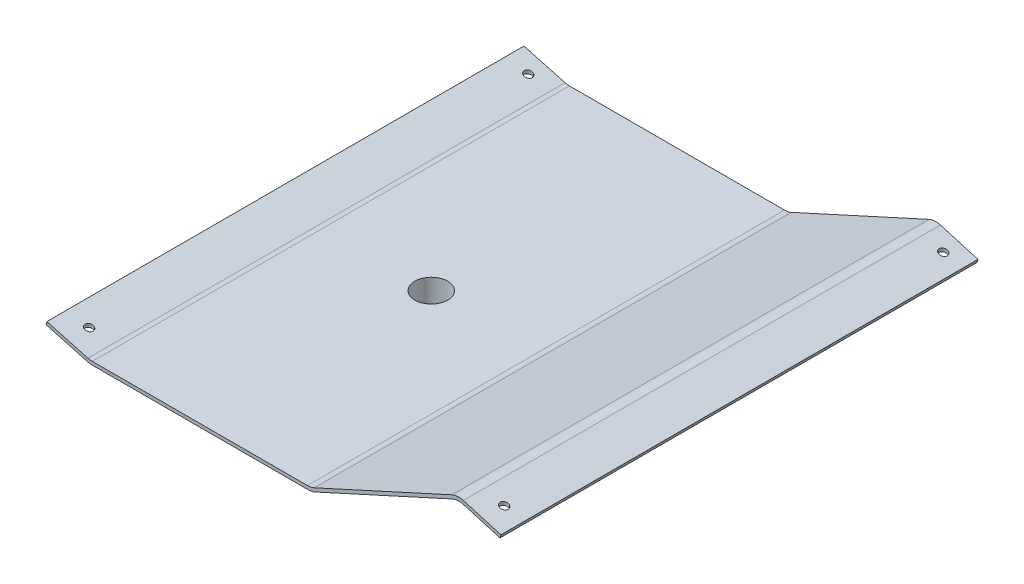
ISO-10303-21;
HEADER;
FILE_DESCRIPTION(('STEP AP214'),'2;1');
FILE_NAME('part.step','',(''),(''),'','','');
FILE_SCHEMA(('AUTOMOTIVE_DESIGN { 1 0 10303 214 1 1 1 1 }'));
ENDSEC;
DATA;
#1=APPLICATION_CONTEXT('core data for automotive mechanical design processes');
#2=APPLICATION_PROTOCOL_DEFINITION('international standard','automotive_design',2000,#1);
#3=PRODUCT_CONTEXT('',#1,'mechanical');
#4=PRODUCT('Part','Part','',(#3));
#5=PRODUCT_RELATED_PRODUCT_CATEGORY('part','',(#4));
#6=PRODUCT_DEFINITION_FORMATION('','',#4);
#7=PRODUCT_DEFINITION_CONTEXT('part definition',#1,'design');
#8=PRODUCT_DEFINITION('design','',#6,#7);
#9=PRODUCT_DEFINITION_SHAPE('','',#8);
#10=(LENGTH_UNIT() NAMED_UNIT(*) SI_UNIT(.MILLI.,.METRE.));
#11=(NAMED_UNIT(*) PLANE_ANGLE_UNIT() SI_UNIT($,.RADIAN.));
#12=(NAMED_UNIT(*) SI_UNIT($,.STERADIAN.) SOLID_ANGLE_UNIT());
#13=UNCERTAINTY_MEASURE_WITH_UNIT(LENGTH_MEASURE(1.E-05),#10,'distance_accuracy_value','');
#14=(GEOMETRIC_REPRESENTATION_CONTEXT(3) GLOBAL_UNCERTAINTY_ASSIGNED_CONTEXT((#13)) GLOBAL_UNIT_ASSIGNED_CONTEXT((#10,
#11,#12)) REPRESENTATION_CONTEXT('',''));
#15=CARTESIAN_POINT('',(0.,0.,0.));
#16=DIRECTION('',(0.,0.,1.));
#17=DIRECTION('',(1.,0.,0.));
#18=AXIS2_PLACEMENT_3D('',#15,#16,#17);
#19=CARTESIAN_POINT('',(-134.732514828827,2.,290.));
#20=DIRECTION('',(-0.262784720073191,-0.964854492084716,0.));
#21=DIRECTION('',(0.964854492084716,-0.262784720073191,0.));
#22=AXIS2_PLACEMENT_3D('',#19,#20,#21);
#23=PLANE('',#22);
#24=CARTESIAN_POINT('',(-148.387339128645,5.71898479067399,10.018712929659));
#25=DIRECTION('',(-0.262784720073191,-0.964854492084716,0.));
#26=DIRECTION('',(0.964854492084716,-0.262784720073191,0.));
#27=AXIS2_PLACEMENT_3D('',#24,#25,#26);
#28=ELLIPSE('',#27,2.50815021316967,2.42);
#29=CARTESIAN_POINT('',(-145.967339128645,5.05988123900469,10.018712929659));
#30=VERTEX_POINT('',#29);
#31=EDGE_CURVE('E284',#30,#30,#28,.F.);
#32=ORIENTED_EDGE('',*,*,#31,.F.);
#33=EDGE_LOOP('',(#32));
#34=FACE_BOUND('',#33,.T.);
#35=DIRECTION('',(-0.964854492084716,0.262784720073191,0.));
#36=VECTOR('',#35,1.);
#37=CARTESIAN_POINT('',(-134.732514828827,2.,290.));
#38=LINE('',#37,#36);
#39=CARTESIAN_POINT('',(-136.022936173691,2.35145507915284,290.));
#40=VERTEX_POINT('',#39);
#41=CARTESIAN_POINT('',(-161.007929092183,9.15628878618217,290.));
#42=VERTEX_POINT('',#41);
#43=EDGE_CURVE('E184',#40,#42,#38,.T.);
#44=ORIENTED_EDGE('',*,*,#43,.F.);
#45=DIRECTION('',(0.,0.,-1.));
#46=VECTOR('',#45,1.);
#47=CARTESIAN_POINT('',(-136.022936173691,2.35145507915284,0.));
#48=LINE('',#47,#46);
#49=CARTESIAN_POINT('',(-136.022936173691,2.35145507915284,0.));
#50=VERTEX_POINT('',#49);
#51=EDGE_CURVE('E267',#40,#50,#48,.T.);
#52=ORIENTED_EDGE('',*,*,#51,.T.);
#53=DIRECTION('',(-0.964854492084716,0.262784720073191,0.));
#54=VECTOR('',#53,1.);
#55=CARTESIAN_POINT('',(-134.732514828827,2.,0.));
#56=LINE('',#55,#54);
#57=CARTESIAN_POINT('',(-161.007929092183,9.15628878618217,0.));
#58=VERTEX_POINT('',#57);
#59=EDGE_CURVE('E208',#50,#58,#56,.T.);
#60=ORIENTED_EDGE('',*,*,#59,.T.);
#61=DIRECTION('',(0.,0.,-1.));
#62=VECTOR('',#61,1.);
#63=CARTESIAN_POINT('',(-161.007929092183,9.15628878618217,290.));
#64=LINE('',#63,#62);
#65=EDGE_CURVE('E220',#42,#58,#64,.T.);
#66=ORIENTED_EDGE('',*,*,#65,.F.);
#67=EDGE_LOOP('',(#44,#52,#60,#66));
#68=FACE_BOUND('',#67,.T.);
#69=CARTESIAN_POINT('',(-148.387339128645,5.71898479067398,276.918712929659));
#70=DIRECTION('',(-0.262784720073191,-0.964854492084716,0.));
#71=DIRECTION('',(0.964854492084716,-0.262784720073191,0.));
#72=AXIS2_PLACEMENT_3D('',#69,#70,#71);
#73=ELLIPSE('',#72,2.50815021369235,2.4200000005043);
#74=CARTESIAN_POINT('',(-145.967339128141,5.05988123886732,276.918712929659));
#75=VERTEX_POINT('',#74);
#76=EDGE_CURVE('E291',#75,#75,#73,.F.);
#77=ORIENTED_EDGE('',*,*,#76,.F.);
#78=EDGE_LOOP('',(#77));
#79=FACE_BOUND('',#78,.T.);
#80=ADVANCED_FACE('F32',(#34,#68,#79),#23,.F.);
#81=CARTESIAN_POINT('',(-135.,0.,290.));
#82=DIRECTION('',(0.262784720073191,0.964854492084716,0.));
#83=DIRECTION('',(-0.964854492084716,0.262784720073191,0.));
#84=AXIS2_PLACEMENT_3D('',#81,#82,#83);
#85=PLANE('',#84);
#86=CARTESIAN_POINT('',(-148.387339128645,3.64613337483129,10.018712929659));
#87=DIRECTION('',(0.262784720073191,0.964854492084716,0.));
#88=DIRECTION('',(0.964854492084716,-0.262784720073191,0.));
#89=AXIS2_PLACEMENT_3D('',#86,#87,#88);
#90=ELLIPSE('',#89,2.50815021316967,2.42);
#91=CARTESIAN_POINT('',(-145.967339128645,2.98702982316198,10.018712929659));
#92=VERTEX_POINT('',#91);
#93=EDGE_CURVE('E281',#92,#92,#90,.F.);
#94=ORIENTED_EDGE('',*,*,#93,.F.);
#95=EDGE_LOOP('',(#94));
#96=FACE_BOUND('',#95,.T.);
#97=DIRECTION('',(0.964854492084716,-0.262784720073191,0.));
#98=VECTOR('',#97,1.);
#99=CARTESIAN_POINT('',(-135.,0.,0.));
#100=LINE('',#99,#98);
#101=CARTESIAN_POINT('',(-161.53349853233,7.22657980201274,0.));
#102=VERTEX_POINT('',#101);
#103=CARTESIAN_POINT('',(-136.290421344864,0.351455079152836,0.));
#104=VERTEX_POINT('',#103);
#105=EDGE_CURVE('E212',#102,#104,#100,.T.);
#106=ORIENTED_EDGE('',*,*,#105,.T.);
#107=DIRECTION('',(0.,0.,-1.));
#108=VECTOR('',#107,1.);
#109=CARTESIAN_POINT('',(-136.290421344864,0.351455079152836,290.));
#110=LINE('',#109,#108);
#111=CARTESIAN_POINT('',(-136.290421344864,0.351455079152836,290.));
#112=VERTEX_POINT('',#111);
#113=EDGE_CURVE('E259',#104,#112,#110,.F.);
#114=ORIENTED_EDGE('',*,*,#113,.T.);
#115=DIRECTION('',(0.964854492084716,-0.262784720073191,0.));
#116=VECTOR('',#115,1.);
#117=CARTESIAN_POINT('',(-135.,0.,290.));
#118=LINE('',#117,#116);
#119=CARTESIAN_POINT('',(-161.53349853233,7.22657980201274,290.));
#120=VERTEX_POINT('',#119);
#121=EDGE_CURVE('E188',#120,#112,#118,.T.);
#122=ORIENTED_EDGE('',*,*,#121,.F.);
#123=DIRECTION('',(0.,0.,-1.));
#124=VECTOR('',#123,1.);
#125=CARTESIAN_POINT('',(-161.53349853233,7.22657980201274,290.));
#126=LINE('',#125,#124);
#127=EDGE_CURVE('E192',#120,#102,#126,.T.);
#128=ORIENTED_EDGE('',*,*,#127,.T.);
#129=EDGE_LOOP('',(#106,#114,#122,#128));
#130=FACE_BOUND('',#129,.T.);
#131=CARTESIAN_POINT('',(-148.387339128645,3.64613337483127,276.918712929659));
#132=DIRECTION('',(0.262784720073191,0.964854492084716,0.));
#133=DIRECTION('',(0.964854492084716,-0.262784720073191,0.));
#134=AXIS2_PLACEMENT_3D('',#131,#132,#133);
#135=ELLIPSE('',#134,2.50815021369235,2.4200000005043);
#136=CARTESIAN_POINT('',(-145.967339128141,2.98702982302461,276.918712929659));
#137=VERTEX_POINT('',#136);
#138=EDGE_CURVE('E36',#137,#137,#135,.F.);
#139=ORIENTED_EDGE('',*,*,#138,.F.);
#140=EDGE_LOOP('',(#139));
#141=FACE_BOUND('',#140,.T.);
#142=ADVANCED_FACE('F354',(#96,#130,#141),#85,.F.);
#143=CARTESIAN_POINT('',(88.7156562349669,40.4448060793865,290.));
#144=DIRECTION('',(0.280081767309427,0.959976147422856,0.));
#145=DIRECTION('',(-0.959976147422856,0.280081767309427,0.));
#146=AXIS2_PLACEMENT_3D('',#143,#144,#145);
#147=PLANE('',#146);
#148=CARTESIAN_POINT('',(103.912660871355,36.0109418341178,10.018712929659));
#149=DIRECTION('',(0.280081767309427,0.959976147422856,0.));
#150=DIRECTION('',(0.959976147422856,-0.280081767309427,0.));
#151=AXIS2_PLACEMENT_3D('',#148,#149,#150);
#152=ELLIPSE('',#151,2.52089596860997,2.42000000000001);
#153=CARTESIAN_POINT('',(106.332660871355,35.3048848360263,10.018712929659));
#154=VERTEX_POINT('',#153);
#155=EDGE_CURVE('E285',#154,#154,#152,.F.);
#156=ORIENTED_EDGE('',*,*,#155,.F.);
#157=EDGE_LOOP('',(#156));
#158=FACE_BOUND('',#157,.T.);
#159=DIRECTION('',(0.959976147422856,-0.280081767309427,0.));
#160=VECTOR('',#159,1.);
#161=CARTESIAN_POINT('',(88.7156562349669,40.4448060793865,290.));
#162=LINE('',#161,#160);
#163=CARTESIAN_POINT('',(92.2831984964595,39.4039431952072,290.));
#164=VERTEX_POINT('',#163);
#165=CARTESIAN_POINT('',(114.421796177012,32.9448060793865,290.));
#166=VERTEX_POINT('',#165);
#167=EDGE_CURVE('E145',#164,#166,#162,.T.);
#168=ORIENTED_EDGE('',*,*,#167,.F.);
#169=DIRECTION('',(0.,0.,-1.));
#170=VECTOR('',#169,1.);
#171=CARTESIAN_POINT('',(92.2831984964595,39.4039431952072,0.));
#172=LINE('',#171,#170);
#173=CARTESIAN_POINT('',(92.2831984964595,39.4039431952072,0.));
#174=VERTEX_POINT('',#173);
#175=EDGE_CURVE('E241',#164,#174,#172,.T.);
#176=ORIENTED_EDGE('',*,*,#175,.T.);
#177=DIRECTION('',(0.959976147422856,-0.280081767309427,0.));
#178=VECTOR('',#177,1.);
#179=CARTESIAN_POINT('',(88.7156562349669,40.4448060793865,0.));
#180=LINE('',#179,#178);
#181=CARTESIAN_POINT('',(114.421796177012,32.9448060793865,0.));
#182=VERTEX_POINT('',#181);
#183=EDGE_CURVE('E165',#174,#182,#180,.T.);
#184=ORIENTED_EDGE('',*,*,#183,.T.);
#185=DIRECTION('',(0.,0.,-1.));
#186=VECTOR('',#185,1.);
#187=CARTESIAN_POINT('',(114.421796177012,32.9448060793865,290.));
#188=LINE('',#187,#186);
#189=EDGE_CURVE('E161',#166,#182,#188,.T.);
#190=ORIENTED_EDGE('',*,*,#189,.F.);
#191=EDGE_LOOP('',(#168,#176,#184,#190));
#192=FACE_BOUND('',#191,.T.);
#193=CARTESIAN_POINT('',(103.912660871355,36.0109418341178,276.918712929659));
#194=DIRECTION('',(0.280081767309427,0.959976147422856,0.));
#195=DIRECTION('',(0.959976147422856,-0.280081767309427,0.));
#196=AXIS2_PLACEMENT_3D('',#193,#194,#195);
#197=ELLIPSE('',#196,2.52089596860997,2.42);
#198=CARTESIAN_POINT('',(106.332660871355,35.3048848360263,276.918712929659));
#199=VERTEX_POINT('',#198);
#200=EDGE_CURVE('E288',#199,#199,#197,.F.);
#201=ORIENTED_EDGE('',*,*,#200,.F.);
#202=EDGE_LOOP('',(#201));
#203=FACE_BOUND('',#202,.T.);
#204=ADVANCED_FACE('F162',(#158,#192,#203),#147,.F.);
#205=CARTESIAN_POINT('',(88.5623113172872,42.5729309510681,290.));
#206=DIRECTION('',(-0.280081767309426,-0.959976147422856,0.));
#207=DIRECTION('',(0.959976147422856,-0.280081767309426,0.));
#208=AXIS2_PLACEMENT_3D('',#205,#206,#207);
#209=PLANE('',#208);
#210=CARTESIAN_POINT('',(103.912660871355,38.0943269321425,10.018712929659));
#211=DIRECTION('',(-0.280081767309426,-0.959976147422856,0.));
#212=DIRECTION('',(0.959976147422856,-0.280081767309426,0.));
#213=AXIS2_PLACEMENT_3D('',#210,#211,#212);
#214=ELLIPSE('',#213,2.52089596860997,2.42000000000001);
#215=CARTESIAN_POINT('',(106.332660871355,37.388269934051,10.018712929659));
#216=VERTEX_POINT('',#215);
#217=EDGE_CURVE('E286',#216,#216,#214,.F.);
#218=ORIENTED_EDGE('',*,*,#217,.F.);
#219=EDGE_LOOP('',(#218));
#220=FACE_BOUND('',#219,.T.);
#221=DIRECTION('',(-0.959976147422856,0.280081767309426,0.));
#222=VECTOR('',#221,1.);
#223=CARTESIAN_POINT('',(88.5623113172872,42.5729309510681,0.));
#224=LINE('',#223,#222);
#225=CARTESIAN_POINT('',(114.981959711631,34.8647583742322,0.));
#226=VERTEX_POINT('',#225);
#227=CARTESIAN_POINT('',(92.1298535787798,41.5320680668887,0.));
#228=VERTEX_POINT('',#227);
#229=EDGE_CURVE('E199',#226,#228,#224,.T.);
#230=ORIENTED_EDGE('',*,*,#229,.T.);
#231=DIRECTION('',(0.,0.,-1.));
#232=VECTOR('',#231,1.);
#233=CARTESIAN_POINT('',(92.1298535787798,41.5320680668887,290.));
#234=LINE('',#233,#232);
#235=CARTESIAN_POINT('',(92.1298535787798,41.5320680668887,290.));
#236=VERTEX_POINT('',#235);
#237=EDGE_CURVE('E237',#228,#236,#234,.F.);
#238=ORIENTED_EDGE('',*,*,#237,.T.);
#239=DIRECTION('',(-0.959976147422856,0.280081767309426,0.));
#240=VECTOR('',#239,1.);
#241=CARTESIAN_POINT('',(88.5623113172872,42.5729309510681,290.));
#242=LINE('',#241,#240);
#243=CARTESIAN_POINT('',(114.981959711631,34.8647583742322,290.));
#244=VERTEX_POINT('',#243);
#245=EDGE_CURVE('E174',#244,#236,#242,.T.);
#246=ORIENTED_EDGE('',*,*,#245,.F.);
#247=DIRECTION('',(0.,0.,-1.));
#248=VECTOR('',#247,1.);
#249=CARTESIAN_POINT('',(114.981959711631,34.8647583742322,290.));
#250=LINE('',#249,#248);
#251=EDGE_CURVE('E169',#244,#226,#250,.T.);
#252=ORIENTED_EDGE('',*,*,#251,.T.);
#253=EDGE_LOOP('',(#230,#238,#246,#252));
#254=FACE_BOUND('',#253,.T.);
#255=CARTESIAN_POINT('',(103.912660871355,38.0943269321425,276.918712929659));
#256=DIRECTION('',(-0.280081767309426,-0.959976147422856,0.));
#257=DIRECTION('',(0.959976147422856,-0.280081767309426,0.));
#258=AXIS2_PLACEMENT_3D('',#255,#256,#257);
#259=ELLIPSE('',#258,2.52089596860997,2.42);
#260=CARTESIAN_POINT('',(106.332660871355,37.388269934051,276.918712929659));
#261=VERTEX_POINT('',#260);
#262=EDGE_CURVE('E289',#261,#261,#259,.F.);
#263=ORIENTED_EDGE('',*,*,#262,.F.);
#264=EDGE_LOOP('',(#263));
#265=FACE_BOUND('',#264,.T.);
#266=ADVANCED_FACE('F319',(#220,#254,#265),#209,.F.);
#267=CARTESIAN_POINT('',(0.,0.,290.));
#268=DIRECTION('',(-0.414818523891144,0.909904166512481,0.));
#269=DIRECTION('',(-0.909904166512481,-0.414818523891144,0.));
#270=AXIS2_PLACEMENT_3D('',#267,#268,#269);
#271=PLANE('',#270);
#272=DIRECTION('',(0.909904166512481,0.414818523891143,0.));
#273=VECTOR('',#272,1.);
#274=CARTESIAN_POINT('',(0.,0.,290.));
#275=LINE('',#274,#273);
#276=CARTESIAN_POINT('',(1.9762515305903,0.900958334875188,290.));
#277=VERTEX_POINT('',#276);
#278=CARTESIAN_POINT('',(85.3341955844538,38.9032233861034,290.));
#279=VERTEX_POINT('',#278);
#280=EDGE_CURVE('E158',#277,#279,#275,.T.);
#281=ORIENTED_EDGE('',*,*,#280,.F.);
#282=DIRECTION('',(0.,0.,-1.));
#283=VECTOR('',#282,1.);
#284=CARTESIAN_POINT('',(1.9762515305903,0.900958334875189,290.));
#285=LINE('',#284,#283);
#286=CARTESIAN_POINT('',(1.9762515305903,0.900958334875188,0.));
#287=VERTEX_POINT('',#286);
#288=EDGE_CURVE('E264',#277,#287,#285,.T.);
#289=ORIENTED_EDGE('',*,*,#288,.T.);
#290=DIRECTION('',(0.909904166512481,0.414818523891143,0.));
#291=VECTOR('',#290,1.);
#292=CARTESIAN_POINT('',(0.,0.,0.));
#293=LINE('',#292,#291);
#294=CARTESIAN_POINT('',(85.3341955844538,38.9032233861034,0.));
#295=VERTEX_POINT('',#294);
#296=EDGE_CURVE('E193',#287,#295,#293,.T.);
#297=ORIENTED_EDGE('',*,*,#296,.T.);
#298=DIRECTION('',(0.,0.,-1.));
#299=VECTOR('',#298,1.);
#300=CARTESIAN_POINT('',(85.3341955844538,38.9032233861034,290.));
#301=LINE('',#300,#299);
#302=EDGE_CURVE('E243',#295,#279,#301,.F.);
#303=ORIENTED_EDGE('',*,*,#302,.T.);
#304=EDGE_LOOP('',(#281,#289,#297,#303));
#305=FACE_BOUND('',#304,.T.);
#306=ADVANCED_FACE('F310',(#305),#271,.F.);
#307=CARTESIAN_POINT('',(114.981959711631,34.8647583742322,290.));
#308=DIRECTION('',(-0.959976147422856,0.280081767309425,0.));
#309=DIRECTION('',(-0.280081767309425,-0.959976147422856,0.));
#310=AXIS2_PLACEMENT_3D('',#307,#308,#309);
#311=PLANE('',#310);
#312=DIRECTION('',(0.280081767309425,0.959976147422856,0.));
#313=VECTOR('',#312,1.);
#314=CARTESIAN_POINT('',(114.981959711631,34.8647583742322,0.));
#315=LINE('',#314,#313);
#316=EDGE_CURVE('E197',#182,#226,#315,.T.);
#317=ORIENTED_EDGE('',*,*,#316,.T.);
#318=ORIENTED_EDGE('',*,*,#251,.F.);
#319=DIRECTION('',(0.280081767309425,0.959976147422856,0.));
#320=VECTOR('',#319,1.);
#321=CARTESIAN_POINT('',(114.981959711631,34.8647583742322,290.));
#322=LINE('',#321,#320);
#323=EDGE_CURVE('E151',#166,#244,#322,.T.);
#324=ORIENTED_EDGE('',*,*,#323,.F.);
#325=ORIENTED_EDGE('',*,*,#189,.T.);
#326=EDGE_LOOP('',(#317,#318,#324,#325));
#327=FACE_BOUND('',#326,.T.);
#328=ADVANCED_FACE('F171',(#327),#311,.F.);
#329=CARTESIAN_POINT('',(-0.434386741664225,2.,290.));
#330=DIRECTION('',(0.414818523891144,-0.909904166512481,0.));
#331=DIRECTION('',(0.909904166512481,0.414818523891144,0.));
#332=AXIS2_PLACEMENT_3D('',#329,#330,#331);
#333=PLANE('',#332);
#334=DIRECTION('',(-0.909904166512481,-0.414818523891144,0.));
#335=VECTOR('',#334,1.);
#336=CARTESIAN_POINT('',(-0.434386741664225,2.,0.));
#337=LINE('',#336,#335);
#338=CARTESIAN_POINT('',(85.1808506667741,41.031348257785,0.));
#339=VERTEX_POINT('',#338);
#340=CARTESIAN_POINT('',(1.54186478892608,2.90095833487519,0.));
#341=VERTEX_POINT('',#340);
#342=EDGE_CURVE('E202',#339,#341,#337,.T.);
#343=ORIENTED_EDGE('',*,*,#342,.T.);
#344=DIRECTION('',(0.,0.,-1.));
#345=VECTOR('',#344,1.);
#346=CARTESIAN_POINT('',(1.54186478892608,2.90095833487519,290.));
#347=LINE('',#346,#345);
#348=CARTESIAN_POINT('',(1.54186478892608,2.90095833487519,290.));
#349=VERTEX_POINT('',#348);
#350=EDGE_CURVE('E275',#341,#349,#347,.F.);
#351=ORIENTED_EDGE('',*,*,#350,.T.);
#352=DIRECTION('',(-0.909904166512481,-0.414818523891144,0.));
#353=VECTOR('',#352,1.);
#354=CARTESIAN_POINT('',(-0.434386741664225,2.,290.));
#355=LINE('',#354,#353);
#356=CARTESIAN_POINT('',(85.1808506667741,41.031348257785,290.));
#357=VERTEX_POINT('',#356);
#358=EDGE_CURVE('E176',#357,#349,#355,.T.);
#359=ORIENTED_EDGE('',*,*,#358,.F.);
#360=DIRECTION('',(0.,0.,-1.));
#361=VECTOR('',#360,1.);
#362=CARTESIAN_POINT('',(85.1808506667741,41.031348257785,290.));
#363=LINE('',#362,#361);
#364=EDGE_CURVE('E229',#357,#339,#363,.T.);
#365=ORIENTED_EDGE('',*,*,#364,.T.);
#366=EDGE_LOOP('',(#343,#351,#359,#365));
#367=FACE_BOUND('',#366,.T.);
#368=ADVANCED_FACE('F329',(#367),#333,.F.);
#369=CARTESIAN_POINT('',(-0.434386741664225,2.,290.));
#370=DIRECTION('',(0.,-1.,0.));
#371=DIRECTION('',(0.,0.,-1.));
#372=AXIS2_PLACEMENT_3D('',#369,#370,#371);
#373=PLANE('',#372);
#374=CARTESIAN_POINT('',(-67.5834507852454,2.,149.769450312708));
#375=DIRECTION('',(0.,1.,0.));
#376=DIRECTION('',(0.,0.,1.));
#377=AXIS2_PLACEMENT_3D('',#374,#375,#376);
#378=CIRCLE('',#377,10.);
#379=CARTESIAN_POINT('',(-67.5834507852454,2.,159.769450312708));
#380=VERTEX_POINT('',#379);
#381=EDGE_CURVE('E232',#380,#380,#378,.T.);
#382=ORIENTED_EDGE('',*,*,#381,.F.);
#383=EDGE_LOOP('',(#382));
#384=FACE_BOUND('',#383,.T.);
#385=DIRECTION('',(-1.,0.,0.));
#386=VECTOR('',#385,1.);
#387=CARTESIAN_POINT('',(-0.434386741664225,2.,0.));
#388=LINE('',#387,#386);
#389=CARTESIAN_POINT('',(-2.60632044998536,2.,0.));
#390=VERTEX_POINT('',#389);
#391=CARTESIAN_POINT('',(-133.395088972959,2.,0.));
#392=VERTEX_POINT('',#391);
#393=EDGE_CURVE('E205',#390,#392,#388,.T.);
#394=ORIENTED_EDGE('',*,*,#393,.T.);
#395=DIRECTION('',(0.,0.,-1.));
#396=VECTOR('',#395,1.);
#397=CARTESIAN_POINT('',(-133.395088972959,2.,290.));
#398=LINE('',#397,#396);
#399=CARTESIAN_POINT('',(-133.395088972959,2.,290.));
#400=VERTEX_POINT('',#399);
#401=EDGE_CURVE('E273',#392,#400,#398,.F.);
#402=ORIENTED_EDGE('',*,*,#401,.T.);
#403=DIRECTION('',(-1.,0.,0.));
#404=VECTOR('',#403,1.);
#405=CARTESIAN_POINT('',(-0.434386741664225,2.,290.));
#406=LINE('',#405,#404);
#407=CARTESIAN_POINT('',(-2.60632044998536,2.,290.));
#408=VERTEX_POINT('',#407);
#409=EDGE_CURVE('E182',#408,#400,#406,.T.);
#410=ORIENTED_EDGE('',*,*,#409,.F.);
#411=DIRECTION('',(0.,0.,-1.));
#412=VECTOR('',#411,1.);
#413=CARTESIAN_POINT('',(-2.60632044998536,2.,1.11022302462516E-13));
#414=LINE('',#413,#412);
#415=EDGE_CURVE('E270',#408,#390,#414,.T.);
#416=ORIENTED_EDGE('',*,*,#415,.T.);
#417=EDGE_LOOP('',(#394,#402,#410,#416));
#418=FACE_BOUND('',#417,.T.);
#419=ADVANCED_FACE('F337',(#384,#418),#373,.F.);
#420=CARTESIAN_POINT('',(-161.007929092183,9.15628878618217,290.));
#421=DIRECTION('',(0.964854492084714,-0.262784720073197,0.));
#422=DIRECTION('',(0.262784720073197,0.964854492084714,0.));
#423=AXIS2_PLACEMENT_3D('',#420,#421,#422);
#424=PLANE('',#423);
#425=DIRECTION('',(-0.262784720073197,-0.964854492084714,0.));
#426=VECTOR('',#425,1.);
#427=CARTESIAN_POINT('',(-161.007929092183,9.15628878618217,0.));
#428=LINE('',#427,#426);
#429=EDGE_CURVE('E210',#58,#102,#428,.T.);
#430=ORIENTED_EDGE('',*,*,#429,.T.);
#431=ORIENTED_EDGE('',*,*,#127,.F.);
#432=DIRECTION('',(-0.262784720073197,-0.964854492084714,0.));
#433=VECTOR('',#432,1.);
#434=CARTESIAN_POINT('',(-161.007929092183,9.15628878618217,290.));
#435=LINE('',#434,#433);
#436=EDGE_CURVE('E186',#42,#120,#435,.T.);
#437=ORIENTED_EDGE('',*,*,#436,.F.);
#438=ORIENTED_EDGE('',*,*,#65,.T.);
#439=EDGE_LOOP('',(#430,#431,#437,#438));
#440=FACE_BOUND('',#439,.T.);
#441=ADVANCED_FACE('F350',(#440),#424,.F.);
#442=CARTESIAN_POINT('',(0.,0.,290.));
#443=DIRECTION('',(0.,1.,0.));
#444=DIRECTION('',(-1.,0.,0.));
#445=AXIS2_PLACEMENT_3D('',#442,#443,#444);
#446=PLANE('',#445);
#447=CARTESIAN_POINT('',(-67.5834507852454,0.,149.769450312708));
#448=DIRECTION('',(0.,1.,0.));
#449=DIRECTION('',(-1.,0.,0.));
#450=AXIS2_PLACEMENT_3D('',#447,#448,#449);
#451=CIRCLE('',#450,60.);
#452=CARTESIAN_POINT('',(-127.583450785245,0.,149.769450312708));
#453=VERTEX_POINT('',#452);
#454=EDGE_CURVE('E195',#453,#453,#451,.T.);
#455=ORIENTED_EDGE('',*,*,#454,.T.);
#456=EDGE_LOOP('',(#455));
#457=FACE_BOUND('',#456,.T.);
#458=DIRECTION('',(1.,0.,0.));
#459=VECTOR('',#458,1.);
#460=CARTESIAN_POINT('',(0.,0.,290.));
#461=LINE('',#460,#459);
#462=CARTESIAN_POINT('',(-133.662574144132,0.,290.));
#463=VERTEX_POINT('',#462);
#464=CARTESIAN_POINT('',(-2.17193370832113,0.,290.));
#465=VERTEX_POINT('',#464);
#466=EDGE_CURVE('E190',#463,#465,#461,.T.);
#467=ORIENTED_EDGE('',*,*,#466,.F.);
#468=DIRECTION('',(0.,0.,-1.));
#469=VECTOR('',#468,1.);
#470=CARTESIAN_POINT('',(-133.662574144132,0.,290.));
#471=LINE('',#470,#469);
#472=CARTESIAN_POINT('',(-133.662574144132,0.,0.));
#473=VERTEX_POINT('',#472);
#474=EDGE_CURVE('E252',#463,#473,#471,.T.);
#475=ORIENTED_EDGE('',*,*,#474,.T.);
#476=DIRECTION('',(1.,0.,0.));
#477=VECTOR('',#476,1.);
#478=CARTESIAN_POINT('',(0.,0.,0.));
#479=LINE('',#478,#477);
#480=CARTESIAN_POINT('',(-2.17193370832113,0.,0.));
#481=VERTEX_POINT('',#480);
#482=EDGE_CURVE('E215',#473,#481,#479,.T.);
#483=ORIENTED_EDGE('',*,*,#482,.T.);
#484=DIRECTION('',(0.,0.,-1.));
#485=VECTOR('',#484,1.);
#486=CARTESIAN_POINT('',(-2.17193370832113,0.,290.));
#487=LINE('',#486,#485);
#488=EDGE_CURVE('E250',#481,#465,#487,.F.);
#489=ORIENTED_EDGE('',*,*,#488,.T.);
#490=EDGE_LOOP('',(#467,#475,#483,#489));
#491=FACE_BOUND('',#490,.T.);
#492=ADVANCED_FACE('F363',(#457,#491),#446,.F.);
#493=CARTESIAN_POINT('',(0.,0.,290.));
#494=DIRECTION('',(0.,0.,-1.));
#495=DIRECTION('',(-1.,0.,0.));
#496=AXIS2_PLACEMENT_3D('',#493,#494,#495);
#497=PLANE('',#496);
#498=ORIENTED_EDGE('',*,*,#121,.T.);
#499=CARTESIAN_POINT('',(-133.662574144132,9.99999999999998,290.));
#500=DIRECTION('',(0.,0.,-1.));
#501=DIRECTION('',(-1.,0.,0.));
#502=AXIS2_PLACEMENT_3D('',#499,#500,#501);
#503=CIRCLE('',#502,10.);
#504=EDGE_CURVE('E262',#112,#463,#503,.F.);
#505=ORIENTED_EDGE('',*,*,#504,.T.);
#506=ORIENTED_EDGE('',*,*,#466,.T.);
#507=CARTESIAN_POINT('',(-2.17193370832114,10.,290.));
#508=DIRECTION('',(0.,0.,-1.));
#509=DIRECTION('',(-1.,0.,0.));
#510=AXIS2_PLACEMENT_3D('',#507,#508,#509);
#511=CIRCLE('',#510,10.);
#512=EDGE_CURVE('E49',#465,#277,#511,.F.);
#513=ORIENTED_EDGE('',*,*,#512,.T.);
#514=ORIENTED_EDGE('',*,*,#280,.T.);
#515=CARTESIAN_POINT('',(89.4823808233653,29.8041817209786,290.));
#516=DIRECTION('',(0.,0.,-1.));
#517=DIRECTION('',(-1.,0.,0.));
#518=AXIS2_PLACEMENT_3D('',#515,#516,#517);
#519=CIRCLE('',#518,10.);
#520=EDGE_CURVE('E154',#279,#164,#519,.T.);
#521=ORIENTED_EDGE('',*,*,#520,.T.);
#522=ORIENTED_EDGE('',*,*,#167,.T.);
#523=ORIENTED_EDGE('',*,*,#323,.T.);
#524=ORIENTED_EDGE('',*,*,#245,.T.);
#525=CARTESIAN_POINT('',(89.3290359056856,31.9323065926602,290.));
#526=DIRECTION('',(0.,0.,-1.));
#527=DIRECTION('',(-1.,0.,0.));
#528=AXIS2_PLACEMENT_3D('',#525,#526,#527);
#529=CIRCLE('',#528,10.);
#530=EDGE_CURVE('E239',#236,#357,#529,.F.);
#531=ORIENTED_EDGE('',*,*,#530,.T.);
#532=ORIENTED_EDGE('',*,*,#358,.T.);
#533=CARTESIAN_POINT('',(-2.60632044998536,12.,290.));
#534=DIRECTION('',(0.,0.,-1.));
#535=DIRECTION('',(-1.,0.,0.));
#536=AXIS2_PLACEMENT_3D('',#533,#534,#535);
#537=CIRCLE('',#536,10.);
#538=EDGE_CURVE('E11',#349,#408,#537,.T.);
#539=ORIENTED_EDGE('',*,*,#538,.T.);
#540=ORIENTED_EDGE('',*,*,#409,.T.);
#541=CARTESIAN_POINT('',(-133.395088972959,12.,290.));
#542=DIRECTION('',(0.,0.,-1.));
#543=DIRECTION('',(-1.,0.,0.));
#544=AXIS2_PLACEMENT_3D('',#541,#542,#543);
#545=CIRCLE('',#544,10.);
#546=EDGE_CURVE('E56',#400,#40,#545,.T.);
#547=ORIENTED_EDGE('',*,*,#546,.T.);
#548=ORIENTED_EDGE('',*,*,#43,.T.);
#549=ORIENTED_EDGE('',*,*,#436,.T.);
#550=EDGE_LOOP('',(#498,#505,#506,#513,#514,#521,#522,#523,#524,#531,#532,#539,#540,#547,#548,#549));
#551=FACE_BOUND('',#550,.T.);
#552=ADVANCED_FACE('F148',(#551),#497,.F.);
#553=CARTESIAN_POINT('',(0.,0.,0.));
#554=DIRECTION('',(0.,0.,-1.));
#555=DIRECTION('',(-1.,0.,0.));
#556=AXIS2_PLACEMENT_3D('',#553,#554,#555);
#557=PLANE('',#556);
#558=ORIENTED_EDGE('',*,*,#482,.F.);
#559=CARTESIAN_POINT('',(-133.662574144132,9.99999999999998,0.));
#560=DIRECTION('',(0.,0.,-1.));
#561=DIRECTION('',(-1.,0.,0.));
#562=AXIS2_PLACEMENT_3D('',#559,#560,#561);
#563=CIRCLE('',#562,10.);
#564=EDGE_CURVE('E257',#473,#104,#563,.T.);
#565=ORIENTED_EDGE('',*,*,#564,.T.);
#566=ORIENTED_EDGE('',*,*,#105,.F.);
#567=ORIENTED_EDGE('',*,*,#429,.F.);
#568=ORIENTED_EDGE('',*,*,#59,.F.);
#569=CARTESIAN_POINT('',(-133.395088972959,12.,0.));
#570=DIRECTION('',(0.,0.,-1.));
#571=DIRECTION('',(-1.,0.,0.));
#572=AXIS2_PLACEMENT_3D('',#569,#570,#571);
#573=CIRCLE('',#572,10.);
#574=EDGE_CURVE('E277',#50,#392,#573,.F.);
#575=ORIENTED_EDGE('',*,*,#574,.T.);
#576=ORIENTED_EDGE('',*,*,#393,.F.);
#577=CARTESIAN_POINT('',(-2.60632044998536,12.,0.));
#578=DIRECTION('',(0.,0.,-1.));
#579=DIRECTION('',(-1.,0.,0.));
#580=AXIS2_PLACEMENT_3D('',#577,#578,#579);
#581=CIRCLE('',#580,10.);
#582=EDGE_CURVE('E41',#390,#341,#581,.F.);
#583=ORIENTED_EDGE('',*,*,#582,.T.);
#584=ORIENTED_EDGE('',*,*,#342,.F.);
#585=CARTESIAN_POINT('',(89.3290359056856,31.9323065926602,0.));
#586=DIRECTION('',(0.,0.,-1.));
#587=DIRECTION('',(-1.,0.,0.));
#588=AXIS2_PLACEMENT_3D('',#585,#586,#587);
#589=CIRCLE('',#588,10.);
#590=EDGE_CURVE('E235',#339,#228,#589,.T.);
#591=ORIENTED_EDGE('',*,*,#590,.T.);
#592=ORIENTED_EDGE('',*,*,#229,.F.);
#593=ORIENTED_EDGE('',*,*,#316,.F.);
#594=ORIENTED_EDGE('',*,*,#183,.F.);
#595=CARTESIAN_POINT('',(89.4823808233653,29.8041817209786,0.));
#596=DIRECTION('',(0.,0.,-1.));
#597=DIRECTION('',(-1.,0.,0.));
#598=AXIS2_PLACEMENT_3D('',#595,#596,#597);
#599=CIRCLE('',#598,10.);
#600=EDGE_CURVE('E246',#174,#295,#599,.F.);
#601=ORIENTED_EDGE('',*,*,#600,.T.);
#602=ORIENTED_EDGE('',*,*,#296,.F.);
#603=CARTESIAN_POINT('',(-2.17193370832114,10.,0.));
#604=DIRECTION('',(0.,0.,-1.));
#605=DIRECTION('',(-1.,0.,0.));
#606=AXIS2_PLACEMENT_3D('',#603,#604,#605);
#607=CIRCLE('',#606,10.);
#608=EDGE_CURVE('E255',#287,#481,#607,.T.);
#609=ORIENTED_EDGE('',*,*,#608,.T.);
#610=EDGE_LOOP('',(#558,#565,#566,#567,#568,#575,#576,#583,#584,#591,#592,#593,#594,#601,#602,#609));
#611=FACE_BOUND('',#610,.T.);
#612=ADVANCED_FACE('F316',(#611),#557,.T.);
#613=CARTESIAN_POINT('',(-67.5834507852454,42.,149.769450312708));
#614=DIRECTION('',(0.,0.,1.));
#615=DIRECTION('',(1.,0.,0.));
#616=AXIS2_PLACEMENT_3D('',#613,#614,#615);
#617=SPHERICAL_SURFACE('',#616,75.);
#618=CARTESIAN_POINT('',(-67.5834507852454,42.,149.769450312708));
#619=DIRECTION('',(0.,1.,0.));
#620=DIRECTION('',(0.,0.,1.));
#621=AXIS2_PLACEMENT_3D('',#618,#619,#620);
#622=SPHERICAL_SURFACE('',#621,75.);
#623=CARTESIAN_POINT('',(-67.5834507852454,-32.3303437365925,149.769450312708));
#624=DIRECTION('',(0.,1.,0.));
#625=DIRECTION('',(0.,0.,1.));
#626=AXIS2_PLACEMENT_3D('',#623,#624,#625);
#627=CIRCLE('',#626,10.);
#628=CARTESIAN_POINT('',(-67.5834507852454,-32.3303437365925,159.769450312708));
#629=VERTEX_POINT('',#628);
#630=EDGE_CURVE('E226',#629,#629,#627,.T.);
#631=ORIENTED_EDGE('',*,*,#630,.T.);
#632=EDGE_LOOP('',(#631));
#633=FACE_BOUND('',#632,.T.);
#634=CARTESIAN_POINT('',(-67.5834507852454,-5.90676016870883,149.769450312708));
#635=DIRECTION('',(0.,1.,0.));
#636=DIRECTION('',(0.,0.,1.));
#637=AXIS2_PLACEMENT_3D('',#634,#635,#636);
#638=CIRCLE('',#637,57.7056524972885);
#639=CARTESIAN_POINT('',(-67.5834507852454,-5.90676016870883,207.475102809997));
#640=VERTEX_POINT('',#639);
#641=EDGE_CURVE('E168',#640,#640,#638,.F.);
#642=ORIENTED_EDGE('',*,*,#641,.T.);
#643=EDGE_LOOP('',(#642));
#644=FACE_BOUND('',#643,.T.);
#645=ADVANCED_FACE('F400',(#633,#644),#622,.T.);
#646=CARTESIAN_POINT('',(-67.5834507852454,0.480807853785687,149.769450312708));
#647=DIRECTION('',(0.,-1.,0.));
#648=DIRECTION('',(0.,0.,-1.));
#649=AXIS2_PLACEMENT_3D('',#646,#647,#648);
#650=TOROIDAL_SURFACE('',#649,50.01156549765,10.);
#651=ORIENTED_EDGE('',*,*,#641,.F.);
#652=EDGE_LOOP('',(#651));
#653=FACE_BOUND('',#652,.T.);
#654=ORIENTED_EDGE('',*,*,#454,.F.);
#655=EDGE_LOOP('',(#654));
#656=FACE_BOUND('',#655,.T.);
#657=ADVANCED_FACE('F403',(#653,#656),#650,.T.);
#658=CARTESIAN_POINT('',(-67.5834507852454,-33.,149.769450312708));
#659=DIRECTION('',(0.,1.,0.));
#660=DIRECTION('',(0.,0.,1.));
#661=AXIS2_PLACEMENT_3D('',#658,#659,#660);
#662=CYLINDRICAL_SURFACE('',#661,10.);
#663=ORIENTED_EDGE('',*,*,#381,.T.);
#664=EDGE_LOOP('',(#663));
#665=FACE_BOUND('',#664,.T.);
#666=ORIENTED_EDGE('',*,*,#630,.F.);
#667=EDGE_LOOP('',(#666));
#668=FACE_BOUND('',#667,.T.);
#669=ADVANCED_FACE('F407',(#665,#668),#662,.F.);
#670=CARTESIAN_POINT('',(89.3290359056856,31.9323065926602,290.));
#671=DIRECTION('',(0.,0.,-1.));
#672=DIRECTION('',(-1.,0.,0.));
#673=AXIS2_PLACEMENT_3D('',#670,#671,#672);
#674=CYLINDRICAL_SURFACE('',#673,10.);
#675=ORIENTED_EDGE('',*,*,#530,.F.);
#676=ORIENTED_EDGE('',*,*,#237,.F.);
#677=ORIENTED_EDGE('',*,*,#590,.F.);
#678=ORIENTED_EDGE('',*,*,#364,.F.);
#679=EDGE_LOOP('',(#675,#676,#677,#678));
#680=FACE_BOUND('',#679,.T.);
#681=ADVANCED_FACE('F326',(#680),#674,.T.);
#682=CARTESIAN_POINT('',(89.4823808233653,29.8041817209786,290.));
#683=DIRECTION('',(0.,0.,1.));
#684=DIRECTION('',(1.,0.,0.));
#685=AXIS2_PLACEMENT_3D('',#682,#683,#684);
#686=CYLINDRICAL_SURFACE('',#685,10.);
#687=ORIENTED_EDGE('',*,*,#520,.F.);
#688=ORIENTED_EDGE('',*,*,#302,.F.);
#689=ORIENTED_EDGE('',*,*,#600,.F.);
#690=ORIENTED_EDGE('',*,*,#175,.F.);
#691=EDGE_LOOP('',(#687,#688,#689,#690));
#692=FACE_BOUND('',#691,.T.);
#693=ADVANCED_FACE('F313',(#692),#686,.F.);
#694=CARTESIAN_POINT('',(-133.662574144132,9.99999999999998,290.));
#695=DIRECTION('',(0.,0.,-1.));
#696=DIRECTION('',(-1.,0.,0.));
#697=AXIS2_PLACEMENT_3D('',#694,#695,#696);
#698=CYLINDRICAL_SURFACE('',#697,10.);
#699=ORIENTED_EDGE('',*,*,#504,.F.);
#700=ORIENTED_EDGE('',*,*,#113,.F.);
#701=ORIENTED_EDGE('',*,*,#564,.F.);
#702=ORIENTED_EDGE('',*,*,#474,.F.);
#703=EDGE_LOOP('',(#699,#700,#701,#702));
#704=FACE_BOUND('',#703,.T.);
#705=ADVANCED_FACE('F361',(#704),#698,.T.);
#706=CARTESIAN_POINT('',(-2.17193370832114,10.,290.));
#707=DIRECTION('',(0.,0.,-1.));
#708=DIRECTION('',(-1.,0.,0.));
#709=AXIS2_PLACEMENT_3D('',#706,#707,#708);
#710=CYLINDRICAL_SURFACE('',#709,10.);
#711=ORIENTED_EDGE('',*,*,#512,.F.);
#712=ORIENTED_EDGE('',*,*,#488,.F.);
#713=ORIENTED_EDGE('',*,*,#608,.F.);
#714=ORIENTED_EDGE('',*,*,#288,.F.);
#715=EDGE_LOOP('',(#711,#712,#713,#714));
#716=FACE_BOUND('',#715,.T.);
#717=ADVANCED_FACE('F366',(#716),#710,.T.);
#718=CARTESIAN_POINT('',(-133.395088972959,12.,290.));
#719=DIRECTION('',(0.,0.,1.));
#720=DIRECTION('',(1.,0.,0.));
#721=AXIS2_PLACEMENT_3D('',#718,#719,#720);
#722=CYLINDRICAL_SURFACE('',#721,10.);
#723=ORIENTED_EDGE('',*,*,#546,.F.);
#724=ORIENTED_EDGE('',*,*,#401,.F.);
#725=ORIENTED_EDGE('',*,*,#574,.F.);
#726=ORIENTED_EDGE('',*,*,#51,.F.);
#727=EDGE_LOOP('',(#723,#724,#725,#726));
#728=FACE_BOUND('',#727,.T.);
#729=ADVANCED_FACE('F341',(#728),#722,.F.);
#730=CARTESIAN_POINT('',(-2.60632044998536,12.,290.));
#731=DIRECTION('',(0.,0.,1.));
#732=DIRECTION('',(1.,0.,0.));
#733=AXIS2_PLACEMENT_3D('',#730,#731,#732);
#734=CYLINDRICAL_SURFACE('',#733,10.);
#735=ORIENTED_EDGE('',*,*,#538,.F.);
#736=ORIENTED_EDGE('',*,*,#350,.F.);
#737=ORIENTED_EDGE('',*,*,#582,.F.);
#738=ORIENTED_EDGE('',*,*,#415,.F.);
#739=EDGE_LOOP('',(#735,#736,#737,#738));
#740=FACE_BOUND('',#739,.T.);
#741=ADVANCED_FACE('F34',(#740),#734,.F.);
#742=CARTESIAN_POINT('',(-148.387339128645,40.,10.018712929659));
#743=DIRECTION('',(0.,-1.,0.));
#744=DIRECTION('',(0.,0.,-1.));
#745=AXIS2_PLACEMENT_3D('',#742,#743,#744);
#746=CYLINDRICAL_SURFACE('',#745,2.42);
#747=ORIENTED_EDGE('',*,*,#93,.T.);
#748=EDGE_LOOP('',(#747));
#749=FACE_BOUND('',#748,.T.);
#750=ORIENTED_EDGE('',*,*,#31,.T.);
#751=EDGE_LOOP('',(#750));
#752=FACE_BOUND('',#751,.T.);
#753=ADVANCED_FACE('F445',(#749,#752),#746,.F.);
#754=CARTESIAN_POINT('',(103.912660871355,40.,10.018712929659));
#755=DIRECTION('',(0.,-1.,0.));
#756=DIRECTION('',(0.,0.,-1.));
#757=AXIS2_PLACEMENT_3D('',#754,#755,#756);
#758=CYLINDRICAL_SURFACE('',#757,2.42000000000001);
#759=ORIENTED_EDGE('',*,*,#217,.T.);
#760=EDGE_LOOP('',(#759));
#761=FACE_BOUND('',#760,.T.);
#762=ORIENTED_EDGE('',*,*,#155,.T.);
#763=EDGE_LOOP('',(#762));
#764=FACE_BOUND('',#763,.T.);
#765=ADVANCED_FACE('F476',(#761,#764),#758,.F.);
#766=CARTESIAN_POINT('',(103.912660871355,40.,276.918712929659));
#767=DIRECTION('',(0.,-1.,0.));
#768=DIRECTION('',(0.,0.,-1.));
#769=AXIS2_PLACEMENT_3D('',#766,#767,#768);
#770=CYLINDRICAL_SURFACE('',#769,2.42);
#771=ORIENTED_EDGE('',*,*,#262,.T.);
#772=EDGE_LOOP('',(#771));
#773=FACE_BOUND('',#772,.T.);
#774=ORIENTED_EDGE('',*,*,#200,.T.);
#775=EDGE_LOOP('',(#774));
#776=FACE_BOUND('',#775,.T.);
#777=ADVANCED_FACE('F486',(#773,#776),#770,.F.);
#778=CARTESIAN_POINT('',(-148.387339128645,40.,276.918712929659));
#779=DIRECTION('',(0.,-1.,0.));
#780=DIRECTION('',(0.,0.,-1.));
#781=AXIS2_PLACEMENT_3D('',#778,#779,#780);
#782=CYLINDRICAL_SURFACE('',#781,2.4200000005043);
#783=ORIENTED_EDGE('',*,*,#138,.T.);
#784=EDGE_LOOP('',(#783));
#785=FACE_BOUND('',#784,.T.);
#786=ORIENTED_EDGE('',*,*,#76,.T.);
#787=EDGE_LOOP('',(#786));
#788=FACE_BOUND('',#787,.T.);
#789=ADVANCED_FACE('F496',(#785,#788),#782,.F.);
#790=CLOSED_SHELL('',(#80,#142,#204,#266,#306,#328,#368,#419,#441,#492,#552,#612,#645,#657,#669,
#681,#693,#705,#717,#729,#741,#753,#765,#777,#789));
#791=MANIFOLD_SOLID_BREP('B2',#790);
#792=ADVANCED_BREP_SHAPE_REPRESENTATION('',(#18,#791),#14);
#793=SHAPE_DEFINITION_REPRESENTATION(#9,#792);
ENDSEC;
END-ISO-10303-21;
